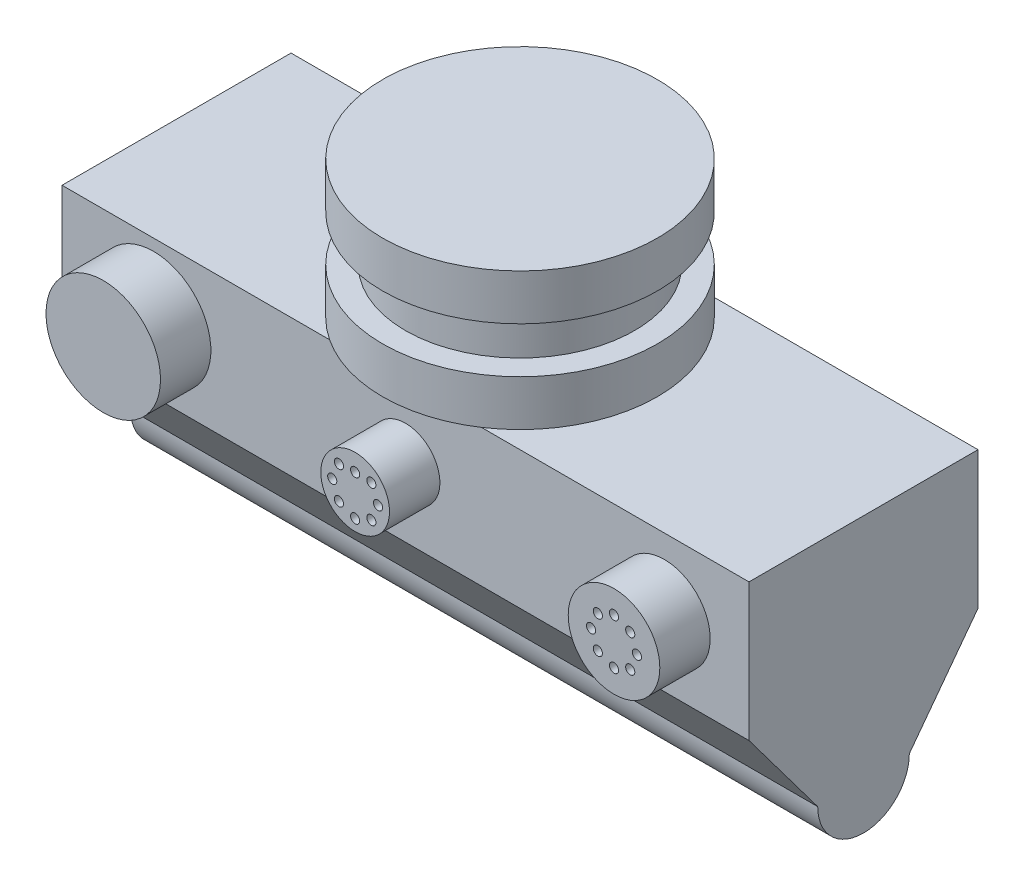
ISO-10303-21;
HEADER;
FILE_DESCRIPTION(('STEP AP214'),'2;1');
FILE_NAME('part.step','',(''),(''),'','','');
FILE_SCHEMA(('AUTOMOTIVE_DESIGN { 1 0 10303 214 1 1 1 1 }'));
ENDSEC;
DATA;
#1=APPLICATION_CONTEXT('core data for automotive mechanical design processes');
#2=APPLICATION_PROTOCOL_DEFINITION('international standard','automotive_design',2000,#1);
#3=PRODUCT_CONTEXT('',#1,'mechanical');
#4=PRODUCT('Part','Part','',(#3));
#5=PRODUCT_RELATED_PRODUCT_CATEGORY('part','',(#4));
#6=PRODUCT_DEFINITION_FORMATION('','',#4);
#7=PRODUCT_DEFINITION_CONTEXT('part definition',#1,'design');
#8=PRODUCT_DEFINITION('design','',#6,#7);
#9=PRODUCT_DEFINITION_SHAPE('','',#8);
#10=(LENGTH_UNIT() NAMED_UNIT(*) SI_UNIT(.MILLI.,.METRE.));
#11=(NAMED_UNIT(*) PLANE_ANGLE_UNIT() SI_UNIT($,.RADIAN.));
#12=(NAMED_UNIT(*) SI_UNIT($,.STERADIAN.) SOLID_ANGLE_UNIT());
#13=UNCERTAINTY_MEASURE_WITH_UNIT(LENGTH_MEASURE(1.E-05),#10,'distance_accuracy_value','');
#14=(GEOMETRIC_REPRESENTATION_CONTEXT(3) GLOBAL_UNCERTAINTY_ASSIGNED_CONTEXT((#13)) GLOBAL_UNIT_ASSIGNED_CONTEXT((#10,
#11,#12)) REPRESENTATION_CONTEXT('',''));
#15=CARTESIAN_POINT('',(0.,0.,0.));
#16=DIRECTION('',(0.,0.,1.));
#17=DIRECTION('',(1.,0.,0.));
#18=AXIS2_PLACEMENT_3D('',#15,#16,#17);
#19=CARTESIAN_POINT('',(0.,80.,0.));
#20=DIRECTION('',(0.,-1.,0.));
#21=DIRECTION('',(0.,0.,-1.));
#22=AXIS2_PLACEMENT_3D('',#19,#20,#21);
#23=CYLINDRICAL_SURFACE('',#22,30.);
#24=CARTESIAN_POINT('',(0.,50.,0.));
#25=DIRECTION('',(0.,1.,0.));
#26=DIRECTION('',(0.,0.,1.));
#27=AXIS2_PLACEMENT_3D('',#24,#25,#26);
#28=CIRCLE('',#27,30.);
#29=CARTESIAN_POINT('',(16.583123951777,50.,25.));
#30=VERTEX_POINT('',#29);
#31=CARTESIAN_POINT('',(16.583123951777,50.,-25.));
#32=VERTEX_POINT('',#31);
#33=EDGE_CURVE('E62',#30,#32,#28,.T.);
#34=ORIENTED_EDGE('',*,*,#33,.T.);
#35=CARTESIAN_POINT('',(-16.583123951777,50.,-25.));
#36=VERTEX_POINT('',#35);
#37=EDGE_CURVE('E63',#32,#36,#28,.T.);
#38=ORIENTED_EDGE('',*,*,#37,.T.);
#39=CARTESIAN_POINT('',(-16.583123951777,50.,25.));
#40=VERTEX_POINT('',#39);
#41=EDGE_CURVE('E13',#36,#40,#28,.T.);
#42=ORIENTED_EDGE('',*,*,#41,.T.);
#43=EDGE_CURVE('E136',#40,#30,#28,.T.);
#44=ORIENTED_EDGE('',*,*,#43,.T.);
#45=EDGE_LOOP('',(#34,#38,#42,#44));
#46=FACE_BOUND('',#45,.T.);
#47=CARTESIAN_POINT('',(0.,60.,0.));
#48=DIRECTION('',(0.,1.,0.));
#49=DIRECTION('',(0.,0.,1.));
#50=AXIS2_PLACEMENT_3D('',#47,#48,#49);
#51=CIRCLE('',#50,30.);
#52=CARTESIAN_POINT('',(0.,60.,30.));
#53=VERTEX_POINT('',#52);
#54=EDGE_CURVE('E140',#53,#53,#51,.T.);
#55=ORIENTED_EDGE('',*,*,#54,.F.);
#56=EDGE_LOOP('',(#55));
#57=FACE_BOUND('',#56,.T.);
#58=ADVANCED_FACE('F51',(#46,#57),#23,.T.);
#59=CARTESIAN_POINT('',(0.,50.,0.));
#60=DIRECTION('',(0.,1.,0.));
#61=DIRECTION('',(0.,0.,1.));
#62=AXIS2_PLACEMENT_3D('',#59,#60,#61);
#63=PLANE('',#62);
#64=ORIENTED_EDGE('',*,*,#33,.F.);
#65=DIRECTION('',(1.,0.,0.));
#66=VECTOR('',#65,1.);
#67=CARTESIAN_POINT('',(-75.,50.,25.));
#68=LINE('',#67,#66);
#69=CARTESIAN_POINT('',(75.,50.,25.));
#70=VERTEX_POINT('',#69);
#71=EDGE_CURVE('E128',#30,#70,#68,.T.);
#72=ORIENTED_EDGE('',*,*,#71,.T.);
#73=DIRECTION('',(0.,0.,-1.));
#74=VECTOR('',#73,1.);
#75=CARTESIAN_POINT('',(75.,50.,-25.));
#76=LINE('',#75,#74);
#77=CARTESIAN_POINT('',(75.,50.,-25.));
#78=VERTEX_POINT('',#77);
#79=EDGE_CURVE('E321',#70,#78,#76,.T.);
#80=ORIENTED_EDGE('',*,*,#79,.T.);
#81=DIRECTION('',(-1.,0.,0.));
#82=VECTOR('',#81,1.);
#83=CARTESIAN_POINT('',(-75.,50.,-25.));
#84=LINE('',#83,#82);
#85=EDGE_CURVE('E326',#78,#32,#84,.T.);
#86=ORIENTED_EDGE('',*,*,#85,.T.);
#87=EDGE_LOOP('',(#64,#72,#80,#86));
#88=FACE_BOUND('',#87,.T.);
#89=ADVANCED_FACE('F393',(#88),#63,.T.);
#90=CARTESIAN_POINT('',(75.,50.,-25.));
#91=DIRECTION('',(-1.,0.,0.));
#92=DIRECTION('',(0.,0.,1.));
#93=AXIS2_PLACEMENT_3D('',#90,#91,#92);
#94=PLANE('',#93);
#95=DIRECTION('',(0.,-1.,0.));
#96=VECTOR('',#95,1.);
#97=CARTESIAN_POINT('',(75.,50.,25.));
#98=LINE('',#97,#96);
#99=CARTESIAN_POINT('',(75.,20.,25.));
#100=VERTEX_POINT('',#99);
#101=EDGE_CURVE('E125',#70,#100,#98,.T.);
#102=ORIENTED_EDGE('',*,*,#101,.T.);
#103=DIRECTION('',(0.,0.800000000000001,0.599999999999999));
#104=VECTOR('',#103,1.);
#105=CARTESIAN_POINT('',(75.,0.,10.));
#106=LINE('',#105,#104);
#107=CARTESIAN_POINT('',(75.,0.,10.));
#108=VERTEX_POINT('',#107);
#109=EDGE_CURVE('E293',#108,#100,#106,.T.);
#110=ORIENTED_EDGE('',*,*,#109,.F.);
#111=CARTESIAN_POINT('',(75.,0.,0.));
#112=DIRECTION('',(1.,0.,0.));
#113=DIRECTION('',(0.,0.,-1.));
#114=AXIS2_PLACEMENT_3D('',#111,#112,#113);
#115=CIRCLE('',#114,10.);
#116=CARTESIAN_POINT('',(75.,0.,-10.));
#117=VERTEX_POINT('',#116);
#118=EDGE_CURVE('E313',#108,#117,#115,.T.);
#119=ORIENTED_EDGE('',*,*,#118,.T.);
#120=DIRECTION('',(0.,-0.800000000000001,0.599999999999999));
#121=VECTOR('',#120,1.);
#122=CARTESIAN_POINT('',(75.,0.,-10.));
#123=LINE('',#122,#121);
#124=CARTESIAN_POINT('',(75.,20.,-25.));
#125=VERTEX_POINT('',#124);
#126=EDGE_CURVE('E292',#125,#117,#123,.T.);
#127=ORIENTED_EDGE('',*,*,#126,.F.);
#128=DIRECTION('',(0.,-1.,0.));
#129=VECTOR('',#128,1.);
#130=CARTESIAN_POINT('',(75.,50.,-25.));
#131=LINE('',#130,#129);
#132=EDGE_CURVE('E342',#78,#125,#131,.T.);
#133=ORIENTED_EDGE('',*,*,#132,.F.);
#134=ORIENTED_EDGE('',*,*,#79,.F.);
#135=EDGE_LOOP('',(#102,#110,#119,#127,#133,#134));
#136=FACE_BOUND('',#135,.T.);
#137=ADVANCED_FACE('F53',(#136),#94,.F.);
#138=CARTESIAN_POINT('',(-75.,50.,-25.));
#139=DIRECTION('',(0.,0.,1.));
#140=DIRECTION('',(1.,0.,0.));
#141=AXIS2_PLACEMENT_3D('',#138,#139,#140);
#142=PLANE('',#141);
#143=ORIENTED_EDGE('',*,*,#132,.T.);
#144=DIRECTION('',(1.,0.,0.));
#145=VECTOR('',#144,1.);
#146=CARTESIAN_POINT('',(-107.,20.,-25.));
#147=LINE('',#146,#145);
#148=CARTESIAN_POINT('',(-75.,20.,-25.));
#149=VERTEX_POINT('',#148);
#150=EDGE_CURVE('E297',#149,#125,#147,.T.);
#151=ORIENTED_EDGE('',*,*,#150,.F.);
#152=DIRECTION('',(0.,-1.,0.));
#153=VECTOR('',#152,1.);
#154=CARTESIAN_POINT('',(-75.,50.,-25.));
#155=LINE('',#154,#153);
#156=CARTESIAN_POINT('',(-75.,50.,-25.));
#157=VERTEX_POINT('',#156);
#158=EDGE_CURVE('E338',#157,#149,#155,.T.);
#159=ORIENTED_EDGE('',*,*,#158,.F.);
#160=EDGE_CURVE('E325',#36,#157,#84,.T.);
#161=ORIENTED_EDGE('',*,*,#160,.F.);
#162=EDGE_CURVE('E329',#32,#36,#84,.T.);
#163=ORIENTED_EDGE('',*,*,#162,.F.);
#164=ORIENTED_EDGE('',*,*,#85,.F.);
#165=EDGE_LOOP('',(#143,#151,#159,#161,#163,#164));
#166=FACE_BOUND('',#165,.T.);
#167=ADVANCED_FACE('F430',(#166),#142,.F.);
#168=CARTESIAN_POINT('',(-75.,50.,-25.));
#169=DIRECTION('',(1.,0.,0.));
#170=DIRECTION('',(0.,0.,-1.));
#171=AXIS2_PLACEMENT_3D('',#168,#169,#170);
#172=PLANE('',#171);
#173=CARTESIAN_POINT('',(-75.,0.,0.));
#174=DIRECTION('',(1.,0.,0.));
#175=DIRECTION('',(0.,0.,-1.));
#176=AXIS2_PLACEMENT_3D('',#173,#174,#175);
#177=CIRCLE('',#176,10.);
#178=CARTESIAN_POINT('',(-75.,0.,-10.));
#179=VERTEX_POINT('',#178);
#180=CARTESIAN_POINT('',(-75.,0.,10.));
#181=VERTEX_POINT('',#180);
#182=EDGE_CURVE('E317',#179,#181,#177,.F.);
#183=ORIENTED_EDGE('',*,*,#182,.T.);
#184=DIRECTION('',(0.,0.800000000000001,0.599999999999999));
#185=VECTOR('',#184,1.);
#186=CARTESIAN_POINT('',(-75.,15.2000000000001,21.4000000000001));
#187=LINE('',#186,#185);
#188=CARTESIAN_POINT('',(-75.,20.,25.));
#189=VERTEX_POINT('',#188);
#190=EDGE_CURVE('E309',#181,#189,#187,.T.);
#191=ORIENTED_EDGE('',*,*,#190,.T.);
#192=DIRECTION('',(0.,-1.,0.));
#193=VECTOR('',#192,1.);
#194=CARTESIAN_POINT('',(-75.,50.,25.));
#195=LINE('',#194,#193);
#196=CARTESIAN_POINT('',(-75.,50.,25.));
#197=VERTEX_POINT('',#196);
#198=EDGE_CURVE('E335',#197,#189,#195,.T.);
#199=ORIENTED_EDGE('',*,*,#198,.F.);
#200=DIRECTION('',(0.,0.,1.));
#201=VECTOR('',#200,1.);
#202=CARTESIAN_POINT('',(-75.,50.,-25.));
#203=LINE('',#202,#201);
#204=EDGE_CURVE('E120',#157,#197,#203,.T.);
#205=ORIENTED_EDGE('',*,*,#204,.F.);
#206=ORIENTED_EDGE('',*,*,#158,.T.);
#207=DIRECTION('',(0.,-0.800000000000001,0.599999999999999));
#208=VECTOR('',#207,1.);
#209=CARTESIAN_POINT('',(-75.,39.2,-39.4));
#210=LINE('',#209,#208);
#211=EDGE_CURVE('E301',#149,#179,#210,.T.);
#212=ORIENTED_EDGE('',*,*,#211,.T.);
#213=EDGE_LOOP('',(#183,#191,#199,#205,#206,#212));
#214=FACE_BOUND('',#213,.T.);
#215=ADVANCED_FACE('F368',(#214),#172,.F.);
#216=CARTESIAN_POINT('',(-75.,50.,25.));
#217=DIRECTION('',(0.,0.,-1.));
#218=DIRECTION('',(-1.,0.,0.));
#219=AXIS2_PLACEMENT_3D('',#216,#217,#218);
#220=PLANE('',#219);
#221=CARTESIAN_POINT('',(0.,35.,25.));
#222=DIRECTION('',(0.,0.,-1.));
#223=DIRECTION('',(-1.,0.,0.));
#224=AXIS2_PLACEMENT_3D('',#221,#222,#223);
#225=CIRCLE('',#224,7.5);
#226=CARTESIAN_POINT('',(-7.49999999999997,35.,25.));
#227=VERTEX_POINT('',#226);
#228=EDGE_CURVE('E55',#227,#227,#225,.F.);
#229=ORIENTED_EDGE('',*,*,#228,.F.);
#230=EDGE_LOOP('',(#229));
#231=FACE_BOUND('',#230,.T.);
#232=CARTESIAN_POINT('',(56.5262057201829,35.,25.));
#233=DIRECTION('',(0.,0.,-1.));
#234=DIRECTION('',(-1.,0.,0.));
#235=AXIS2_PLACEMENT_3D('',#232,#233,#234);
#236=CIRCLE('',#235,9.99999999999999);
#237=CARTESIAN_POINT('',(46.5262057201829,35.,25.));
#238=VERTEX_POINT('',#237);
#239=EDGE_CURVE('E355',#238,#238,#236,.F.);
#240=ORIENTED_EDGE('',*,*,#239,.F.);
#241=EDGE_LOOP('',(#240));
#242=FACE_BOUND('',#241,.T.);
#243=CARTESIAN_POINT('',(-55.,35.,25.));
#244=DIRECTION('',(0.,0.,-1.));
#245=DIRECTION('',(-1.,0.,0.));
#246=AXIS2_PLACEMENT_3D('',#243,#244,#245);
#247=CIRCLE('',#246,12.5);
#248=CARTESIAN_POINT('',(-67.5,35.,25.));
#249=VERTEX_POINT('',#248);
#250=EDGE_CURVE('E352',#249,#249,#247,.F.);
#251=ORIENTED_EDGE('',*,*,#250,.F.);
#252=EDGE_LOOP('',(#251));
#253=FACE_BOUND('',#252,.T.);
#254=ORIENTED_EDGE('',*,*,#198,.T.);
#255=DIRECTION('',(1.,0.,0.));
#256=VECTOR('',#255,1.);
#257=CARTESIAN_POINT('',(-107.,20.,25.));
#258=LINE('',#257,#256);
#259=EDGE_CURVE('E296',#189,#100,#258,.T.);
#260=ORIENTED_EDGE('',*,*,#259,.T.);
#261=ORIENTED_EDGE('',*,*,#101,.F.);
#262=ORIENTED_EDGE('',*,*,#71,.F.);
#263=EDGE_CURVE('E126',#40,#30,#68,.T.);
#264=ORIENTED_EDGE('',*,*,#263,.F.);
#265=EDGE_CURVE('E116',#197,#40,#68,.T.);
#266=ORIENTED_EDGE('',*,*,#265,.F.);
#267=EDGE_LOOP('',(#254,#260,#261,#262,#264,#266));
#268=FACE_BOUND('',#267,.T.);
#269=ADVANCED_FACE('F131',(#231,#242,#253,#268),#220,.F.);
#270=ORIENTED_EDGE('',*,*,#41,.F.);
#271=ORIENTED_EDGE('',*,*,#160,.T.);
#272=ORIENTED_EDGE('',*,*,#204,.T.);
#273=ORIENTED_EDGE('',*,*,#265,.T.);
#274=EDGE_LOOP('',(#270,#271,#272,#273));
#275=FACE_BOUND('',#274,.T.);
#276=ADVANCED_FACE('F118',(#275),#63,.T.);
#277=CARTESIAN_POINT('',(-103.284271247462,0.,0.));
#278=DIRECTION('',(1.,0.,0.));
#279=DIRECTION('',(0.,0.,-1.));
#280=AXIS2_PLACEMENT_3D('',#277,#278,#279);
#281=CYLINDRICAL_SURFACE('',#280,10.);
#282=DIRECTION('',(1.,0.,0.));
#283=VECTOR('',#282,1.);
#284=CARTESIAN_POINT('',(-103.284271247462,0.,10.));
#285=LINE('',#284,#283);
#286=EDGE_CURVE('E349',#181,#108,#285,.T.);
#287=ORIENTED_EDGE('',*,*,#286,.F.);
#288=ORIENTED_EDGE('',*,*,#182,.F.);
#289=DIRECTION('',(1.,0.,0.));
#290=VECTOR('',#289,1.);
#291=CARTESIAN_POINT('',(-103.284271247462,0.,-10.));
#292=LINE('',#291,#290);
#293=EDGE_CURVE('E346',#117,#179,#292,.F.);
#294=ORIENTED_EDGE('',*,*,#293,.F.);
#295=ORIENTED_EDGE('',*,*,#118,.F.);
#296=EDGE_LOOP('',(#287,#288,#294,#295));
#297=FACE_BOUND('',#296,.T.);
#298=ADVANCED_FACE('F513',(#297),#281,.T.);
#299=CARTESIAN_POINT('',(-107.,0.,-10.));
#300=DIRECTION('',(0.,0.599999999999999,0.800000000000001));
#301=DIRECTION('',(0.,-0.800000000000001,0.599999999999999));
#302=AXIS2_PLACEMENT_3D('',#299,#300,#301);
#303=PLANE('',#302);
#304=ORIENTED_EDGE('',*,*,#150,.T.);
#305=ORIENTED_EDGE('',*,*,#126,.T.);
#306=ORIENTED_EDGE('',*,*,#293,.T.);
#307=ORIENTED_EDGE('',*,*,#211,.F.);
#308=EDGE_LOOP('',(#304,#305,#306,#307));
#309=FACE_BOUND('',#308,.T.);
#310=ADVANCED_FACE('F388',(#309),#303,.F.);
#311=CARTESIAN_POINT('',(-107.,0.,10.));
#312=DIRECTION('',(0.,0.599999999999999,-0.800000000000001));
#313=DIRECTION('',(0.,0.800000000000001,0.599999999999999));
#314=AXIS2_PLACEMENT_3D('',#311,#312,#313);
#315=PLANE('',#314);
#316=ORIENTED_EDGE('',*,*,#286,.T.);
#317=ORIENTED_EDGE('',*,*,#109,.T.);
#318=ORIENTED_EDGE('',*,*,#259,.F.);
#319=ORIENTED_EDGE('',*,*,#190,.F.);
#320=EDGE_LOOP('',(#316,#317,#318,#319));
#321=FACE_BOUND('',#320,.T.);
#322=ADVANCED_FACE('F378',(#321),#315,.F.);
#323=CARTESIAN_POINT('',(-55.,35.,36.));
#324=DIRECTION('',(0.,0.,-1.));
#325=DIRECTION('',(-1.,0.,0.));
#326=AXIS2_PLACEMENT_3D('',#323,#324,#325);
#327=CYLINDRICAL_SURFACE('',#326,12.5);
#328=CARTESIAN_POINT('',(-55.,35.,36.));
#329=DIRECTION('',(0.,0.,1.));
#330=DIRECTION('',(1.,0.,0.));
#331=AXIS2_PLACEMENT_3D('',#328,#329,#330);
#332=CIRCLE('',#331,12.5);
#333=CARTESIAN_POINT('',(-42.5,35.,36.));
#334=VERTEX_POINT('',#333);
#335=EDGE_CURVE('E288',#334,#334,#332,.T.);
#336=ORIENTED_EDGE('',*,*,#335,.F.);
#337=EDGE_LOOP('',(#336));
#338=FACE_BOUND('',#337,.T.);
#339=ORIENTED_EDGE('',*,*,#250,.T.);
#340=EDGE_LOOP('',(#339));
#341=FACE_BOUND('',#340,.T.);
#342=ADVANCED_FACE('F375',(#338,#341),#327,.T.);
#343=CARTESIAN_POINT('',(-55.,35.,36.));
#344=DIRECTION('',(0.,0.,1.));
#345=DIRECTION('',(1.,0.,0.));
#346=AXIS2_PLACEMENT_3D('',#343,#344,#345);
#347=PLANE('',#346);
#348=ORIENTED_EDGE('',*,*,#335,.T.);
#349=EDGE_LOOP('',(#348));
#350=FACE_BOUND('',#349,.T.);
#351=ADVANCED_FACE('F377',(#350),#347,.T.);
#352=CARTESIAN_POINT('',(56.5262057201829,35.,36.));
#353=DIRECTION('',(0.,0.,1.));
#354=DIRECTION('',(1.,0.,0.));
#355=AXIS2_PLACEMENT_3D('',#352,#353,#354);
#356=PLANE('',#355);
#357=CARTESIAN_POINT('',(51.526205720183,35.,36.));
#358=DIRECTION('',(0.,0.,1.));
#359=DIRECTION('',(1.,0.,0.));
#360=AXIS2_PLACEMENT_3D('',#357,#358,#359);
#361=CIRCLE('',#360,1.00000000000001);
#362=CARTESIAN_POINT('',(52.526205720183,35.,36.));
#363=VERTEX_POINT('',#362);
#364=EDGE_CURVE('E229',#363,#363,#361,.T.);
#365=ORIENTED_EDGE('',*,*,#364,.F.);
#366=EDGE_LOOP('',(#365));
#367=FACE_BOUND('',#366,.T.);
#368=CARTESIAN_POINT('',(56.526205720183,30.,36.));
#369=DIRECTION('',(0.,0.,1.));
#370=DIRECTION('',(1.,0.,0.));
#371=AXIS2_PLACEMENT_3D('',#368,#369,#370);
#372=CIRCLE('',#371,1.);
#373=CARTESIAN_POINT('',(57.526205720183,30.,36.));
#374=VERTEX_POINT('',#373);
#375=EDGE_CURVE('E245',#374,#374,#372,.T.);
#376=ORIENTED_EDGE('',*,*,#375,.F.);
#377=EDGE_LOOP('',(#376));
#378=FACE_BOUND('',#377,.T.);
#379=CARTESIAN_POINT('',(61.526205720183,35.0000000000001,36.));
#380=DIRECTION('',(0.,0.,1.));
#381=DIRECTION('',(1.,0.,0.));
#382=AXIS2_PLACEMENT_3D('',#379,#380,#381);
#383=CIRCLE('',#382,0.999999999999994);
#384=CARTESIAN_POINT('',(62.526205720183,35.0000000000001,36.));
#385=VERTEX_POINT('',#384);
#386=EDGE_CURVE('E261',#385,#385,#383,.T.);
#387=ORIENTED_EDGE('',*,*,#386,.F.);
#388=EDGE_LOOP('',(#387));
#389=FACE_BOUND('',#388,.T.);
#390=CARTESIAN_POINT('',(56.5262057201829,40.,36.));
#391=DIRECTION('',(0.,0.,1.));
#392=DIRECTION('',(1.,0.,0.));
#393=AXIS2_PLACEMENT_3D('',#390,#391,#392);
#394=CIRCLE('',#393,0.999999999999998);
#395=CARTESIAN_POINT('',(57.5262057201829,40.,36.));
#396=VERTEX_POINT('',#395);
#397=EDGE_CURVE('E277',#396,#396,#394,.T.);
#398=ORIENTED_EDGE('',*,*,#397,.F.);
#399=EDGE_LOOP('',(#398));
#400=FACE_BOUND('',#399,.T.);
#401=CARTESIAN_POINT('',(56.5262057201829,35.,36.));
#402=DIRECTION('',(0.,0.,1.));
#403=DIRECTION('',(1.,0.,0.));
#404=AXIS2_PLACEMENT_3D('',#401,#402,#403);
#405=CIRCLE('',#404,9.99999999999999);
#406=CARTESIAN_POINT('',(66.5262057201829,35.,36.));
#407=VERTEX_POINT('',#406);
#408=EDGE_CURVE('E281',#407,#407,#405,.T.);
#409=ORIENTED_EDGE('',*,*,#408,.T.);
#410=EDGE_LOOP('',(#409));
#411=FACE_BOUND('',#410,.T.);
#412=CARTESIAN_POINT('',(60.0617396261156,38.5355339059328,36.));
#413=DIRECTION('',(0.,0.,1.));
#414=DIRECTION('',(1.,0.,0.));
#415=AXIS2_PLACEMENT_3D('',#412,#413,#414);
#416=CIRCLE('',#415,0.999999999999995);
#417=CARTESIAN_POINT('',(61.0617396261156,38.5355339059328,36.));
#418=VERTEX_POINT('',#417);
#419=EDGE_CURVE('E269',#418,#418,#416,.T.);
#420=ORIENTED_EDGE('',*,*,#419,.F.);
#421=EDGE_LOOP('',(#420));
#422=FACE_BOUND('',#421,.T.);
#423=CARTESIAN_POINT('',(60.0617396261158,31.4644660940673,36.));
#424=DIRECTION('',(0.,0.,1.));
#425=DIRECTION('',(1.,0.,0.));
#426=AXIS2_PLACEMENT_3D('',#423,#424,#425);
#427=CIRCLE('',#426,0.999999999999998);
#428=CARTESIAN_POINT('',(61.0617396261158,31.4644660940673,36.));
#429=VERTEX_POINT('',#428);
#430=EDGE_CURVE('E253',#429,#429,#427,.T.);
#431=ORIENTED_EDGE('',*,*,#430,.F.);
#432=EDGE_LOOP('',(#431));
#433=FACE_BOUND('',#432,.T.);
#434=CARTESIAN_POINT('',(52.9906718142502,31.4644660940673,36.));
#435=DIRECTION('',(0.,0.,1.));
#436=DIRECTION('',(1.,0.,0.));
#437=AXIS2_PLACEMENT_3D('',#434,#435,#436);
#438=CIRCLE('',#437,1.);
#439=CARTESIAN_POINT('',(53.9906718142502,31.4644660940673,36.));
#440=VERTEX_POINT('',#439);
#441=EDGE_CURVE('E237',#440,#440,#438,.T.);
#442=ORIENTED_EDGE('',*,*,#441,.F.);
#443=EDGE_LOOP('',(#442));
#444=FACE_BOUND('',#443,.T.);
#445=CARTESIAN_POINT('',(52.9906718142502,38.5355339059327,36.));
#446=DIRECTION('',(0.,0.,1.));
#447=DIRECTION('',(1.,0.,0.));
#448=AXIS2_PLACEMENT_3D('',#445,#446,#447);
#449=CIRCLE('',#448,1.);
#450=CARTESIAN_POINT('',(53.9906718142502,38.5355339059327,36.));
#451=VERTEX_POINT('',#450);
#452=EDGE_CURVE('E221',#451,#451,#449,.T.);
#453=ORIENTED_EDGE('',*,*,#452,.F.);
#454=EDGE_LOOP('',(#453));
#455=FACE_BOUND('',#454,.T.);
#456=ADVANCED_FACE('F385',(#367,#378,#389,#400,#411,#422,#433,#444,#455),#356,.T.);
#457=CARTESIAN_POINT('',(56.5262057201829,35.,36.));
#458=DIRECTION('',(0.,0.,-1.));
#459=DIRECTION('',(-1.,0.,0.));
#460=AXIS2_PLACEMENT_3D('',#457,#458,#459);
#461=CYLINDRICAL_SURFACE('',#460,9.99999999999999);
#462=ORIENTED_EDGE('',*,*,#408,.F.);
#463=EDGE_LOOP('',(#462));
#464=FACE_BOUND('',#463,.T.);
#465=ORIENTED_EDGE('',*,*,#239,.T.);
#466=EDGE_LOOP('',(#465));
#467=FACE_BOUND('',#466,.T.);
#468=ADVANCED_FACE('F844',(#464,#467),#461,.T.);
#469=CARTESIAN_POINT('',(56.5262057201829,40.,36.));
#470=DIRECTION('',(0.,0.,-1.));
#471=DIRECTION('',(-1.,0.,0.));
#472=AXIS2_PLACEMENT_3D('',#469,#470,#471);
#473=CYLINDRICAL_SURFACE('',#472,0.999999999999998);
#474=ORIENTED_EDGE('',*,*,#397,.T.);
#475=EDGE_LOOP('',(#474));
#476=FACE_BOUND('',#475,.T.);
#477=CARTESIAN_POINT('',(56.5262057201829,40.,25.));
#478=DIRECTION('',(0.,0.,1.));
#479=DIRECTION('',(1.,0.,0.));
#480=AXIS2_PLACEMENT_3D('',#477,#478,#479);
#481=CIRCLE('',#480,0.999999999999998);
#482=CARTESIAN_POINT('',(57.5262057201829,40.,25.));
#483=VERTEX_POINT('',#482);
#484=EDGE_CURVE('E273',#483,#483,#481,.T.);
#485=ORIENTED_EDGE('',*,*,#484,.F.);
#486=EDGE_LOOP('',(#485));
#487=FACE_BOUND('',#486,.T.);
#488=ADVANCED_FACE('F834',(#476,#487),#473,.F.);
#489=CARTESIAN_POINT('',(60.0617396261156,38.5355339059328,36.));
#490=DIRECTION('',(0.,0.,-1.));
#491=DIRECTION('',(-1.,0.,0.));
#492=AXIS2_PLACEMENT_3D('',#489,#490,#491);
#493=CYLINDRICAL_SURFACE('',#492,0.999999999999995);
#494=ORIENTED_EDGE('',*,*,#419,.T.);
#495=EDGE_LOOP('',(#494));
#496=FACE_BOUND('',#495,.T.);
#497=CARTESIAN_POINT('',(60.0617396261156,38.5355339059328,25.));
#498=DIRECTION('',(0.,0.,1.));
#499=DIRECTION('',(1.,0.,0.));
#500=AXIS2_PLACEMENT_3D('',#497,#498,#499);
#501=CIRCLE('',#500,0.999999999999995);
#502=CARTESIAN_POINT('',(61.0617396261156,38.5355339059328,25.));
#503=VERTEX_POINT('',#502);
#504=EDGE_CURVE('E265',#503,#503,#501,.T.);
#505=ORIENTED_EDGE('',*,*,#504,.F.);
#506=EDGE_LOOP('',(#505));
#507=FACE_BOUND('',#506,.T.);
#508=ADVANCED_FACE('F824',(#496,#507),#493,.F.);
#509=CARTESIAN_POINT('',(61.526205720183,35.0000000000001,36.));
#510=DIRECTION('',(0.,0.,-1.));
#511=DIRECTION('',(-1.,0.,0.));
#512=AXIS2_PLACEMENT_3D('',#509,#510,#511);
#513=CYLINDRICAL_SURFACE('',#512,0.999999999999994);
#514=ORIENTED_EDGE('',*,*,#386,.T.);
#515=EDGE_LOOP('',(#514));
#516=FACE_BOUND('',#515,.T.);
#517=CARTESIAN_POINT('',(61.526205720183,35.0000000000001,25.));
#518=DIRECTION('',(0.,0.,1.));
#519=DIRECTION('',(1.,0.,0.));
#520=AXIS2_PLACEMENT_3D('',#517,#518,#519);
#521=CIRCLE('',#520,0.999999999999994);
#522=CARTESIAN_POINT('',(62.526205720183,35.0000000000001,25.));
#523=VERTEX_POINT('',#522);
#524=EDGE_CURVE('E257',#523,#523,#521,.T.);
#525=ORIENTED_EDGE('',*,*,#524,.F.);
#526=EDGE_LOOP('',(#525));
#527=FACE_BOUND('',#526,.T.);
#528=ADVANCED_FACE('F814',(#516,#527),#513,.F.);
#529=CARTESIAN_POINT('',(60.0617396261158,31.4644660940673,36.));
#530=DIRECTION('',(0.,0.,-1.));
#531=DIRECTION('',(-1.,0.,0.));
#532=AXIS2_PLACEMENT_3D('',#529,#530,#531);
#533=CYLINDRICAL_SURFACE('',#532,0.999999999999998);
#534=ORIENTED_EDGE('',*,*,#430,.T.);
#535=EDGE_LOOP('',(#534));
#536=FACE_BOUND('',#535,.T.);
#537=CARTESIAN_POINT('',(60.0617396261158,31.4644660940673,25.));
#538=DIRECTION('',(0.,0.,1.));
#539=DIRECTION('',(1.,0.,0.));
#540=AXIS2_PLACEMENT_3D('',#537,#538,#539);
#541=CIRCLE('',#540,0.999999999999998);
#542=CARTESIAN_POINT('',(61.0617396261158,31.4644660940673,25.));
#543=VERTEX_POINT('',#542);
#544=EDGE_CURVE('E249',#543,#543,#541,.T.);
#545=ORIENTED_EDGE('',*,*,#544,.F.);
#546=EDGE_LOOP('',(#545));
#547=FACE_BOUND('',#546,.T.);
#548=ADVANCED_FACE('F804',(#536,#547),#533,.F.);
#549=CARTESIAN_POINT('',(56.526205720183,30.,36.));
#550=DIRECTION('',(0.,0.,-1.));
#551=DIRECTION('',(-1.,0.,0.));
#552=AXIS2_PLACEMENT_3D('',#549,#550,#551);
#553=CYLINDRICAL_SURFACE('',#552,1.);
#554=ORIENTED_EDGE('',*,*,#375,.T.);
#555=EDGE_LOOP('',(#554));
#556=FACE_BOUND('',#555,.T.);
#557=CARTESIAN_POINT('',(56.526205720183,30.,25.));
#558=DIRECTION('',(0.,0.,1.));
#559=DIRECTION('',(1.,0.,0.));
#560=AXIS2_PLACEMENT_3D('',#557,#558,#559);
#561=CIRCLE('',#560,1.);
#562=CARTESIAN_POINT('',(57.526205720183,30.,25.));
#563=VERTEX_POINT('',#562);
#564=EDGE_CURVE('E241',#563,#563,#561,.T.);
#565=ORIENTED_EDGE('',*,*,#564,.F.);
#566=EDGE_LOOP('',(#565));
#567=FACE_BOUND('',#566,.T.);
#568=ADVANCED_FACE('F794',(#556,#567),#553,.F.);
#569=CARTESIAN_POINT('',(52.9906718142502,31.4644660940673,36.));
#570=DIRECTION('',(0.,0.,-1.));
#571=DIRECTION('',(-1.,0.,0.));
#572=AXIS2_PLACEMENT_3D('',#569,#570,#571);
#573=CYLINDRICAL_SURFACE('',#572,1.);
#574=ORIENTED_EDGE('',*,*,#441,.T.);
#575=EDGE_LOOP('',(#574));
#576=FACE_BOUND('',#575,.T.);
#577=CARTESIAN_POINT('',(52.9906718142502,31.4644660940673,25.));
#578=DIRECTION('',(0.,0.,1.));
#579=DIRECTION('',(1.,0.,0.));
#580=AXIS2_PLACEMENT_3D('',#577,#578,#579);
#581=CIRCLE('',#580,1.);
#582=CARTESIAN_POINT('',(53.9906718142502,31.4644660940673,25.));
#583=VERTEX_POINT('',#582);
#584=EDGE_CURVE('E233',#583,#583,#581,.T.);
#585=ORIENTED_EDGE('',*,*,#584,.F.);
#586=EDGE_LOOP('',(#585));
#587=FACE_BOUND('',#586,.T.);
#588=ADVANCED_FACE('F784',(#576,#587),#573,.F.);
#589=CARTESIAN_POINT('',(51.526205720183,35.,36.));
#590=DIRECTION('',(0.,0.,-1.));
#591=DIRECTION('',(-1.,0.,0.));
#592=AXIS2_PLACEMENT_3D('',#589,#590,#591);
#593=CYLINDRICAL_SURFACE('',#592,1.00000000000001);
#594=ORIENTED_EDGE('',*,*,#364,.T.);
#595=EDGE_LOOP('',(#594));
#596=FACE_BOUND('',#595,.T.);
#597=CARTESIAN_POINT('',(51.526205720183,35.,25.));
#598=DIRECTION('',(0.,0.,1.));
#599=DIRECTION('',(1.,0.,0.));
#600=AXIS2_PLACEMENT_3D('',#597,#598,#599);
#601=CIRCLE('',#600,1.00000000000001);
#602=CARTESIAN_POINT('',(52.526205720183,35.,25.));
#603=VERTEX_POINT('',#602);
#604=EDGE_CURVE('E225',#603,#603,#601,.T.);
#605=ORIENTED_EDGE('',*,*,#604,.F.);
#606=EDGE_LOOP('',(#605));
#607=FACE_BOUND('',#606,.T.);
#608=ADVANCED_FACE('F774',(#596,#607),#593,.F.);
#609=CARTESIAN_POINT('',(52.9906718142502,38.5355339059327,36.));
#610=DIRECTION('',(0.,0.,-1.));
#611=DIRECTION('',(-1.,0.,0.));
#612=AXIS2_PLACEMENT_3D('',#609,#610,#611);
#613=CYLINDRICAL_SURFACE('',#612,1.);
#614=ORIENTED_EDGE('',*,*,#452,.T.);
#615=EDGE_LOOP('',(#614));
#616=FACE_BOUND('',#615,.T.);
#617=CARTESIAN_POINT('',(52.9906718142502,38.5355339059327,25.));
#618=DIRECTION('',(0.,0.,1.));
#619=DIRECTION('',(1.,0.,0.));
#620=AXIS2_PLACEMENT_3D('',#617,#618,#619);
#621=CIRCLE('',#620,1.);
#622=CARTESIAN_POINT('',(53.9906718142502,38.5355339059327,25.));
#623=VERTEX_POINT('',#622);
#624=EDGE_CURVE('E220',#623,#623,#621,.T.);
#625=ORIENTED_EDGE('',*,*,#624,.F.);
#626=EDGE_LOOP('',(#625));
#627=FACE_BOUND('',#626,.T.);
#628=ADVANCED_FACE('F766',(#616,#627),#613,.F.);
#629=ORIENTED_EDGE('',*,*,#604,.T.);
#630=EDGE_LOOP('',(#629));
#631=FACE_BOUND('',#630,.T.);
#632=ADVANCED_FACE('F705',(#631),#220,.F.);
#633=ORIENTED_EDGE('',*,*,#584,.T.);
#634=EDGE_LOOP('',(#633));
#635=FACE_BOUND('',#634,.T.);
#636=ADVANCED_FACE('F750',(#635),#220,.F.);
#637=ORIENTED_EDGE('',*,*,#564,.T.);
#638=EDGE_LOOP('',(#637));
#639=FACE_BOUND('',#638,.T.);
#640=ADVANCED_FACE('F741',(#639),#220,.F.);
#641=ORIENTED_EDGE('',*,*,#544,.T.);
#642=EDGE_LOOP('',(#641));
#643=FACE_BOUND('',#642,.T.);
#644=ADVANCED_FACE('F732',(#643),#220,.F.);
#645=ORIENTED_EDGE('',*,*,#524,.T.);
#646=EDGE_LOOP('',(#645));
#647=FACE_BOUND('',#646,.T.);
#648=ADVANCED_FACE('F723',(#647),#220,.F.);
#649=ORIENTED_EDGE('',*,*,#504,.T.);
#650=EDGE_LOOP('',(#649));
#651=FACE_BOUND('',#650,.T.);
#652=ADVANCED_FACE('F714',(#651),#220,.F.);
#653=ORIENTED_EDGE('',*,*,#484,.T.);
#654=EDGE_LOOP('',(#653));
#655=FACE_BOUND('',#654,.T.);
#656=ADVANCED_FACE('F440',(#655),#220,.F.);
#657=ORIENTED_EDGE('',*,*,#624,.T.);
#658=EDGE_LOOP('',(#657));
#659=FACE_BOUND('',#658,.T.);
#660=ADVANCED_FACE('F371',(#659),#220,.F.);
#661=CARTESIAN_POINT('',(0.,35.,36.));
#662=DIRECTION('',(0.,0.,1.));
#663=DIRECTION('',(1.,0.,0.));
#664=AXIS2_PLACEMENT_3D('',#661,#662,#663);
#665=PLANE('',#664);
#666=CARTESIAN_POINT('',(-4.99999999999991,35.,36.));
#667=DIRECTION('',(0.,0.,1.));
#668=DIRECTION('',(1.,0.,0.));
#669=AXIS2_PLACEMENT_3D('',#666,#667,#668);
#670=CIRCLE('',#669,1.00000000000001);
#671=CARTESIAN_POINT('',(-3.9999999999999,35.,36.));
#672=VERTEX_POINT('',#671);
#673=EDGE_CURVE('E161',#672,#672,#670,.T.);
#674=ORIENTED_EDGE('',*,*,#673,.F.);
#675=EDGE_LOOP('',(#674));
#676=FACE_BOUND('',#675,.T.);
#677=CARTESIAN_POINT('',(1.38777878078145E-13,30.,36.));
#678=DIRECTION('',(0.,0.,1.));
#679=DIRECTION('',(1.,0.,0.));
#680=AXIS2_PLACEMENT_3D('',#677,#678,#679);
#681=CIRCLE('',#680,1.);
#682=CARTESIAN_POINT('',(1.00000000000014,30.,36.));
#683=VERTEX_POINT('',#682);
#684=EDGE_CURVE('E177',#683,#683,#681,.T.);
#685=ORIENTED_EDGE('',*,*,#684,.F.);
#686=EDGE_LOOP('',(#685));
#687=FACE_BOUND('',#686,.T.);
#688=CARTESIAN_POINT('',(5.0000000000001,35.0000000000001,36.));
#689=DIRECTION('',(0.,0.,1.));
#690=DIRECTION('',(1.,0.,0.));
#691=AXIS2_PLACEMENT_3D('',#688,#689,#690);
#692=CIRCLE('',#691,0.999999999999994);
#693=CARTESIAN_POINT('',(6.0000000000001,35.0000000000001,36.));
#694=VERTEX_POINT('',#693);
#695=EDGE_CURVE('E193',#694,#694,#692,.T.);
#696=ORIENTED_EDGE('',*,*,#695,.F.);
#697=EDGE_LOOP('',(#696));
#698=FACE_BOUND('',#697,.T.);
#699=CARTESIAN_POINT('',(0.,38.75,36.));
#700=DIRECTION('',(0.,0.,1.));
#701=DIRECTION('',(1.,0.,0.));
#702=AXIS2_PLACEMENT_3D('',#699,#700,#701);
#703=CIRCLE('',#702,0.999999999999999);
#704=CARTESIAN_POINT('',(1.00000000000002,38.75,36.));
#705=VERTEX_POINT('',#704);
#706=EDGE_CURVE('E209',#705,#705,#703,.T.);
#707=ORIENTED_EDGE('',*,*,#706,.F.);
#708=EDGE_LOOP('',(#707));
#709=FACE_BOUND('',#708,.T.);
#710=CARTESIAN_POINT('',(0.,35.,36.));
#711=DIRECTION('',(0.,0.,1.));
#712=DIRECTION('',(1.,0.,0.));
#713=AXIS2_PLACEMENT_3D('',#710,#711,#712);
#714=CIRCLE('',#713,7.5);
#715=CARTESIAN_POINT('',(7.50000000000003,35.,36.));
#716=VERTEX_POINT('',#715);
#717=EDGE_CURVE('E213',#716,#716,#714,.T.);
#718=ORIENTED_EDGE('',*,*,#717,.T.);
#719=EDGE_LOOP('',(#718));
#720=FACE_BOUND('',#719,.T.);
#721=CARTESIAN_POINT('',(3.53553390593277,38.5355339059328,36.));
#722=DIRECTION('',(0.,0.,1.));
#723=DIRECTION('',(1.,0.,0.));
#724=AXIS2_PLACEMENT_3D('',#721,#722,#723);
#725=CIRCLE('',#724,0.999999999999995);
#726=CARTESIAN_POINT('',(4.53553390593277,38.5355339059328,36.));
#727=VERTEX_POINT('',#726);
#728=EDGE_CURVE('E201',#727,#727,#725,.T.);
#729=ORIENTED_EDGE('',*,*,#728,.F.);
#730=EDGE_LOOP('',(#729));
#731=FACE_BOUND('',#730,.T.);
#732=CARTESIAN_POINT('',(3.53553390593288,31.4644660940673,36.));
#733=DIRECTION('',(0.,0.,1.));
#734=DIRECTION('',(1.,0.,0.));
#735=AXIS2_PLACEMENT_3D('',#732,#733,#734);
#736=CIRCLE('',#735,0.999999999999998);
#737=CARTESIAN_POINT('',(4.53553390593288,31.4644660940673,36.));
#738=VERTEX_POINT('',#737);
#739=EDGE_CURVE('E185',#738,#738,#736,.T.);
#740=ORIENTED_EDGE('',*,*,#739,.F.);
#741=EDGE_LOOP('',(#740));
#742=FACE_BOUND('',#741,.T.);
#743=CARTESIAN_POINT('',(-3.53553390593263,31.4644660940673,36.));
#744=DIRECTION('',(0.,0.,1.));
#745=DIRECTION('',(1.,0.,0.));
#746=AXIS2_PLACEMENT_3D('',#743,#744,#745);
#747=CIRCLE('',#746,1.);
#748=CARTESIAN_POINT('',(-2.53553390593263,31.4644660940673,36.));
#749=VERTEX_POINT('',#748);
#750=EDGE_CURVE('E169',#749,#749,#747,.T.);
#751=ORIENTED_EDGE('',*,*,#750,.F.);
#752=EDGE_LOOP('',(#751));
#753=FACE_BOUND('',#752,.T.);
#754=CARTESIAN_POINT('',(-3.53553390593265,38.5355339059327,36.));
#755=DIRECTION('',(0.,0.,1.));
#756=DIRECTION('',(1.,0.,0.));
#757=AXIS2_PLACEMENT_3D('',#754,#755,#756);
#758=CIRCLE('',#757,1.);
#759=CARTESIAN_POINT('',(-2.53553390593264,38.5355339059327,36.));
#760=VERTEX_POINT('',#759);
#761=EDGE_CURVE('E152',#760,#760,#758,.T.);
#762=ORIENTED_EDGE('',*,*,#761,.F.);
#763=EDGE_LOOP('',(#762));
#764=FACE_BOUND('',#763,.T.);
#765=ADVANCED_FACE('F684',(#676,#687,#698,#709,#720,#731,#742,#753,#764),#665,.T.);
#766=CARTESIAN_POINT('',(0.,35.,36.));
#767=DIRECTION('',(0.,0.,-1.));
#768=DIRECTION('',(-1.,0.,0.));
#769=AXIS2_PLACEMENT_3D('',#766,#767,#768);
#770=CYLINDRICAL_SURFACE('',#769,7.5);
#771=ORIENTED_EDGE('',*,*,#717,.F.);
#772=EDGE_LOOP('',(#771));
#773=FACE_BOUND('',#772,.T.);
#774=ORIENTED_EDGE('',*,*,#228,.T.);
#775=EDGE_LOOP('',(#774));
#776=FACE_BOUND('',#775,.T.);
#777=ADVANCED_FACE('F364',(#773,#776),#770,.T.);
#778=CARTESIAN_POINT('',(0.,38.75,36.));
#779=DIRECTION('',(0.,0.,-1.));
#780=DIRECTION('',(-1.,0.,0.));
#781=AXIS2_PLACEMENT_3D('',#778,#779,#780);
#782=CYLINDRICAL_SURFACE('',#781,0.999999999999999);
#783=ORIENTED_EDGE('',*,*,#706,.T.);
#784=EDGE_LOOP('',(#783));
#785=FACE_BOUND('',#784,.T.);
#786=CARTESIAN_POINT('',(0.,38.75,25.));
#787=DIRECTION('',(0.,0.,1.));
#788=DIRECTION('',(1.,0.,0.));
#789=AXIS2_PLACEMENT_3D('',#786,#787,#788);
#790=CIRCLE('',#789,0.999999999999999);
#791=CARTESIAN_POINT('',(1.00000000000002,38.75,25.));
#792=VERTEX_POINT('',#791);
#793=EDGE_CURVE('E205',#792,#792,#790,.T.);
#794=ORIENTED_EDGE('',*,*,#793,.F.);
#795=EDGE_LOOP('',(#794));
#796=FACE_BOUND('',#795,.T.);
#797=ADVANCED_FACE('F665',(#785,#796),#782,.F.);
#798=CARTESIAN_POINT('',(3.53553390593277,38.5355339059328,36.));
#799=DIRECTION('',(0.,0.,-1.));
#800=DIRECTION('',(-1.,0.,0.));
#801=AXIS2_PLACEMENT_3D('',#798,#799,#800);
#802=CYLINDRICAL_SURFACE('',#801,0.999999999999995);
#803=ORIENTED_EDGE('',*,*,#728,.T.);
#804=EDGE_LOOP('',(#803));
#805=FACE_BOUND('',#804,.T.);
#806=CARTESIAN_POINT('',(3.53553390593277,38.5355339059328,25.));
#807=DIRECTION('',(0.,0.,1.));
#808=DIRECTION('',(1.,0.,0.));
#809=AXIS2_PLACEMENT_3D('',#806,#807,#808);
#810=CIRCLE('',#809,0.999999999999995);
#811=CARTESIAN_POINT('',(4.53553390593277,38.5355339059328,25.));
#812=VERTEX_POINT('',#811);
#813=EDGE_CURVE('E197',#812,#812,#810,.T.);
#814=ORIENTED_EDGE('',*,*,#813,.F.);
#815=EDGE_LOOP('',(#814));
#816=FACE_BOUND('',#815,.T.);
#817=ADVANCED_FACE('F655',(#805,#816),#802,.F.);
#818=CARTESIAN_POINT('',(5.0000000000001,35.0000000000001,36.));
#819=DIRECTION('',(0.,0.,-1.));
#820=DIRECTION('',(-1.,0.,0.));
#821=AXIS2_PLACEMENT_3D('',#818,#819,#820);
#822=CYLINDRICAL_SURFACE('',#821,0.999999999999994);
#823=ORIENTED_EDGE('',*,*,#695,.T.);
#824=EDGE_LOOP('',(#823));
#825=FACE_BOUND('',#824,.T.);
#826=CARTESIAN_POINT('',(5.0000000000001,35.0000000000001,25.));
#827=DIRECTION('',(0.,0.,1.));
#828=DIRECTION('',(1.,0.,0.));
#829=AXIS2_PLACEMENT_3D('',#826,#827,#828);
#830=CIRCLE('',#829,0.999999999999994);
#831=CARTESIAN_POINT('',(6.0000000000001,35.0000000000001,25.));
#832=VERTEX_POINT('',#831);
#833=EDGE_CURVE('E189',#832,#832,#830,.T.);
#834=ORIENTED_EDGE('',*,*,#833,.F.);
#835=EDGE_LOOP('',(#834));
#836=FACE_BOUND('',#835,.T.);
#837=ADVANCED_FACE('F645',(#825,#836),#822,.F.);
#838=CARTESIAN_POINT('',(3.53553390593288,31.4644660940673,36.));
#839=DIRECTION('',(0.,0.,-1.));
#840=DIRECTION('',(-1.,0.,0.));
#841=AXIS2_PLACEMENT_3D('',#838,#839,#840);
#842=CYLINDRICAL_SURFACE('',#841,0.999999999999998);
#843=ORIENTED_EDGE('',*,*,#739,.T.);
#844=EDGE_LOOP('',(#843));
#845=FACE_BOUND('',#844,.T.);
#846=CARTESIAN_POINT('',(3.53553390593288,31.4644660940673,25.));
#847=DIRECTION('',(0.,0.,1.));
#848=DIRECTION('',(1.,0.,0.));
#849=AXIS2_PLACEMENT_3D('',#846,#847,#848);
#850=CIRCLE('',#849,0.999999999999998);
#851=CARTESIAN_POINT('',(4.53553390593288,31.4644660940673,25.));
#852=VERTEX_POINT('',#851);
#853=EDGE_CURVE('E181',#852,#852,#850,.T.);
#854=ORIENTED_EDGE('',*,*,#853,.F.);
#855=EDGE_LOOP('',(#854));
#856=FACE_BOUND('',#855,.T.);
#857=ADVANCED_FACE('F635',(#845,#856),#842,.F.);
#858=CARTESIAN_POINT('',(1.38777878078145E-13,30.,36.));
#859=DIRECTION('',(0.,0.,-1.));
#860=DIRECTION('',(-1.,0.,0.));
#861=AXIS2_PLACEMENT_3D('',#858,#859,#860);
#862=CYLINDRICAL_SURFACE('',#861,1.);
#863=ORIENTED_EDGE('',*,*,#684,.T.);
#864=EDGE_LOOP('',(#863));
#865=FACE_BOUND('',#864,.T.);
#866=CARTESIAN_POINT('',(1.38777878078145E-13,30.,25.));
#867=DIRECTION('',(0.,0.,1.));
#868=DIRECTION('',(1.,0.,0.));
#869=AXIS2_PLACEMENT_3D('',#866,#867,#868);
#870=CIRCLE('',#869,1.);
#871=CARTESIAN_POINT('',(1.00000000000014,30.,25.));
#872=VERTEX_POINT('',#871);
#873=EDGE_CURVE('E173',#872,#872,#870,.T.);
#874=ORIENTED_EDGE('',*,*,#873,.F.);
#875=EDGE_LOOP('',(#874));
#876=FACE_BOUND('',#875,.T.);
#877=ADVANCED_FACE('F625',(#865,#876),#862,.F.);
#878=CARTESIAN_POINT('',(-3.53553390593263,31.4644660940673,36.));
#879=DIRECTION('',(0.,0.,-1.));
#880=DIRECTION('',(-1.,0.,0.));
#881=AXIS2_PLACEMENT_3D('',#878,#879,#880);
#882=CYLINDRICAL_SURFACE('',#881,1.);
#883=ORIENTED_EDGE('',*,*,#750,.T.);
#884=EDGE_LOOP('',(#883));
#885=FACE_BOUND('',#884,.T.);
#886=CARTESIAN_POINT('',(-3.53553390593263,31.4644660940673,25.));
#887=DIRECTION('',(0.,0.,1.));
#888=DIRECTION('',(1.,0.,0.));
#889=AXIS2_PLACEMENT_3D('',#886,#887,#888);
#890=CIRCLE('',#889,1.);
#891=CARTESIAN_POINT('',(-2.53553390593263,31.4644660940673,25.));
#892=VERTEX_POINT('',#891);
#893=EDGE_CURVE('E165',#892,#892,#890,.T.);
#894=ORIENTED_EDGE('',*,*,#893,.F.);
#895=EDGE_LOOP('',(#894));
#896=FACE_BOUND('',#895,.T.);
#897=ADVANCED_FACE('F615',(#885,#896),#882,.F.);
#898=CARTESIAN_POINT('',(-4.99999999999991,35.,36.));
#899=DIRECTION('',(0.,0.,-1.));
#900=DIRECTION('',(-1.,0.,0.));
#901=AXIS2_PLACEMENT_3D('',#898,#899,#900);
#902=CYLINDRICAL_SURFACE('',#901,1.00000000000001);
#903=ORIENTED_EDGE('',*,*,#673,.T.);
#904=EDGE_LOOP('',(#903));
#905=FACE_BOUND('',#904,.T.);
#906=CARTESIAN_POINT('',(-4.99999999999991,35.,25.));
#907=DIRECTION('',(0.,0.,1.));
#908=DIRECTION('',(1.,0.,0.));
#909=AXIS2_PLACEMENT_3D('',#906,#907,#908);
#910=CIRCLE('',#909,1.00000000000001);
#911=CARTESIAN_POINT('',(-3.9999999999999,35.,25.));
#912=VERTEX_POINT('',#911);
#913=EDGE_CURVE('E156',#912,#912,#910,.T.);
#914=ORIENTED_EDGE('',*,*,#913,.F.);
#915=EDGE_LOOP('',(#914));
#916=FACE_BOUND('',#915,.T.);
#917=ADVANCED_FACE('F606',(#905,#916),#902,.F.);
#918=CARTESIAN_POINT('',(-3.53553390593265,38.5355339059327,36.));
#919=DIRECTION('',(0.,0.,-1.));
#920=DIRECTION('',(-1.,0.,0.));
#921=AXIS2_PLACEMENT_3D('',#918,#919,#920);
#922=CYLINDRICAL_SURFACE('',#921,1.);
#923=ORIENTED_EDGE('',*,*,#761,.T.);
#924=EDGE_LOOP('',(#923));
#925=FACE_BOUND('',#924,.T.);
#926=CARTESIAN_POINT('',(-3.53553390593265,38.5355339059327,25.));
#927=DIRECTION('',(0.,0.,1.));
#928=DIRECTION('',(1.,0.,0.));
#929=AXIS2_PLACEMENT_3D('',#926,#927,#928);
#930=CIRCLE('',#929,1.);
#931=CARTESIAN_POINT('',(-2.53553390593264,38.5355339059327,25.));
#932=VERTEX_POINT('',#931);
#933=EDGE_CURVE('E157',#932,#932,#930,.T.);
#934=ORIENTED_EDGE('',*,*,#933,.F.);
#935=EDGE_LOOP('',(#934));
#936=FACE_BOUND('',#935,.T.);
#937=ADVANCED_FACE('F598',(#925,#936),#922,.F.);
#938=ORIENTED_EDGE('',*,*,#913,.T.);
#939=EDGE_LOOP('',(#938));
#940=FACE_BOUND('',#939,.T.);
#941=ADVANCED_FACE('F441',(#940),#220,.F.);
#942=ORIENTED_EDGE('',*,*,#893,.T.);
#943=EDGE_LOOP('',(#942));
#944=FACE_BOUND('',#943,.T.);
#945=ADVANCED_FACE('F582',(#944),#220,.F.);
#946=ORIENTED_EDGE('',*,*,#873,.T.);
#947=EDGE_LOOP('',(#946));
#948=FACE_BOUND('',#947,.T.);
#949=ADVANCED_FACE('F573',(#948),#220,.F.);
#950=ORIENTED_EDGE('',*,*,#853,.T.);
#951=EDGE_LOOP('',(#950));
#952=FACE_BOUND('',#951,.T.);
#953=ADVANCED_FACE('F564',(#952),#220,.F.);
#954=ORIENTED_EDGE('',*,*,#833,.T.);
#955=EDGE_LOOP('',(#954));
#956=FACE_BOUND('',#955,.T.);
#957=ADVANCED_FACE('F555',(#956),#220,.F.);
#958=ORIENTED_EDGE('',*,*,#813,.T.);
#959=EDGE_LOOP('',(#958));
#960=FACE_BOUND('',#959,.T.);
#961=ADVANCED_FACE('F545',(#960),#220,.F.);
#962=ORIENTED_EDGE('',*,*,#793,.T.);
#963=EDGE_LOOP('',(#962));
#964=FACE_BOUND('',#963,.T.);
#965=ADVANCED_FACE('F370',(#964),#220,.F.);
#966=ORIENTED_EDGE('',*,*,#933,.T.);
#967=EDGE_LOOP('',(#966));
#968=FACE_BOUND('',#967,.T.);
#969=ADVANCED_FACE('F433',(#968),#220,.F.);
#970=CARTESIAN_POINT('',(0.,50.,0.));
#971=DIRECTION('',(0.,1.,0.));
#972=DIRECTION('',(0.,0.,1.));
#973=AXIS2_PLACEMENT_3D('',#970,#971,#972);
#974=PLANE('',#973);
#975=ORIENTED_EDGE('',*,*,#37,.F.);
#976=ORIENTED_EDGE('',*,*,#162,.T.);
#977=EDGE_LOOP('',(#975,#976));
#978=FACE_BOUND('',#977,.T.);
#979=ADVANCED_FACE('F432',(#978),#974,.F.);
#980=ORIENTED_EDGE('',*,*,#43,.F.);
#981=ORIENTED_EDGE('',*,*,#263,.T.);
#982=EDGE_LOOP('',(#980,#981));
#983=FACE_BOUND('',#982,.T.);
#984=ADVANCED_FACE('F137',(#983),#974,.F.);
#985=CARTESIAN_POINT('',(0.,60.,0.));
#986=DIRECTION('',(0.,1.,0.));
#987=DIRECTION('',(0.,0.,1.));
#988=AXIS2_PLACEMENT_3D('',#985,#986,#987);
#989=PLANE('',#988);
#990=CARTESIAN_POINT('',(0.,60.,0.));
#991=DIRECTION('',(0.,1.,0.));
#992=DIRECTION('',(0.,0.,1.));
#993=AXIS2_PLACEMENT_3D('',#990,#991,#992);
#994=CIRCLE('',#993,25.);
#995=CARTESIAN_POINT('',(0.,60.,25.));
#996=VERTEX_POINT('',#995);
#997=EDGE_CURVE('E457',#996,#996,#994,.T.);
#998=ORIENTED_EDGE('',*,*,#997,.F.);
#999=EDGE_LOOP('',(#998));
#1000=FACE_BOUND('',#999,.T.);
#1001=ORIENTED_EDGE('',*,*,#54,.T.);
#1002=EDGE_LOOP('',(#1001));
#1003=FACE_BOUND('',#1002,.T.);
#1004=ADVANCED_FACE('F437',(#1000,#1003),#989,.T.);
#1005=CARTESIAN_POINT('',(0.,70.,0.));
#1006=DIRECTION('',(0.,1.,0.));
#1007=DIRECTION('',(0.,0.,1.));
#1008=AXIS2_PLACEMENT_3D('',#1005,#1006,#1007);
#1009=PLANE('',#1008);
#1010=CARTESIAN_POINT('',(0.,70.,0.));
#1011=DIRECTION('',(0.,1.,0.));
#1012=DIRECTION('',(0.,0.,1.));
#1013=AXIS2_PLACEMENT_3D('',#1010,#1011,#1012);
#1014=CIRCLE('',#1013,25.);
#1015=CARTESIAN_POINT('',(0.,70.,25.));
#1016=VERTEX_POINT('',#1015);
#1017=EDGE_CURVE('E460',#1016,#1016,#1014,.T.);
#1018=ORIENTED_EDGE('',*,*,#1017,.T.);
#1019=EDGE_LOOP('',(#1018));
#1020=FACE_BOUND('',#1019,.T.);
#1021=CARTESIAN_POINT('',(0.,70.,0.));
#1022=DIRECTION('',(0.,1.,0.));
#1023=DIRECTION('',(0.,0.,1.));
#1024=AXIS2_PLACEMENT_3D('',#1021,#1022,#1023);
#1025=CIRCLE('',#1024,30.);
#1026=CARTESIAN_POINT('',(0.,70.,30.));
#1027=VERTEX_POINT('',#1026);
#1028=EDGE_CURVE('E416',#1027,#1027,#1025,.T.);
#1029=ORIENTED_EDGE('',*,*,#1028,.F.);
#1030=EDGE_LOOP('',(#1029));
#1031=FACE_BOUND('',#1030,.T.);
#1032=ADVANCED_FACE('F443',(#1020,#1031),#1009,.F.);
#1033=CARTESIAN_POINT('',(0.,60.,0.));
#1034=DIRECTION('',(0.,1.,0.));
#1035=DIRECTION('',(0.,0.,1.));
#1036=AXIS2_PLACEMENT_3D('',#1033,#1034,#1035);
#1037=CYLINDRICAL_SURFACE('',#1036,25.);
#1038=ORIENTED_EDGE('',*,*,#997,.T.);
#1039=EDGE_LOOP('',(#1038));
#1040=FACE_BOUND('',#1039,.T.);
#1041=ORIENTED_EDGE('',*,*,#1017,.F.);
#1042=EDGE_LOOP('',(#1041));
#1043=FACE_BOUND('',#1042,.T.);
#1044=ADVANCED_FACE('F410',(#1040,#1043),#1037,.T.);
#1045=CARTESIAN_POINT('',(0.,80.,0.));
#1046=DIRECTION('',(0.,1.,0.));
#1047=DIRECTION('',(0.,0.,1.));
#1048=AXIS2_PLACEMENT_3D('',#1045,#1046,#1047);
#1049=PLANE('',#1048);
#1050=CARTESIAN_POINT('',(0.,80.,0.));
#1051=DIRECTION('',(0.,1.,0.));
#1052=DIRECTION('',(0.,0.,1.));
#1053=AXIS2_PLACEMENT_3D('',#1050,#1051,#1052);
#1054=CIRCLE('',#1053,30.);
#1055=CARTESIAN_POINT('',(0.,80.,30.));
#1056=VERTEX_POINT('',#1055);
#1057=EDGE_CURVE('E148',#1056,#1056,#1054,.T.);
#1058=ORIENTED_EDGE('',*,*,#1057,.T.);
#1059=EDGE_LOOP('',(#1058));
#1060=FACE_BOUND('',#1059,.T.);
#1061=ADVANCED_FACE('F405',(#1060),#1049,.T.);
#1062=ORIENTED_EDGE('',*,*,#1028,.T.);
#1063=EDGE_LOOP('',(#1062));
#1064=FACE_BOUND('',#1063,.T.);
#1065=ORIENTED_EDGE('',*,*,#1057,.F.);
#1066=EDGE_LOOP('',(#1065));
#1067=FACE_BOUND('',#1066,.T.);
#1068=ADVANCED_FACE('F395',(#1064,#1067),#23,.T.);
#1069=CLOSED_SHELL('',(#58,#89,#137,#167,#215,#269,#276,#298,#310,#322,#342,#351,#456,#468,#488,
#508,#528,#548,#568,#588,#608,#628,#632,#636,#640,#644,#648,#652,#656,#660,#765,#777,#797,#817,
#837,#857,#877,#897,#917,#937,#941,#945,#949,#953,#957,#961,#965,#969,#979,#984,#1004,#1032,
#1044,#1061,#1068));
#1070=MANIFOLD_SOLID_BREP('B2',#1069);
#1071=ADVANCED_BREP_SHAPE_REPRESENTATION('',(#18,#1070),#14);
#1072=SHAPE_DEFINITION_REPRESENTATION(#9,#1071);
ENDSEC;
END-ISO-10303-21;
